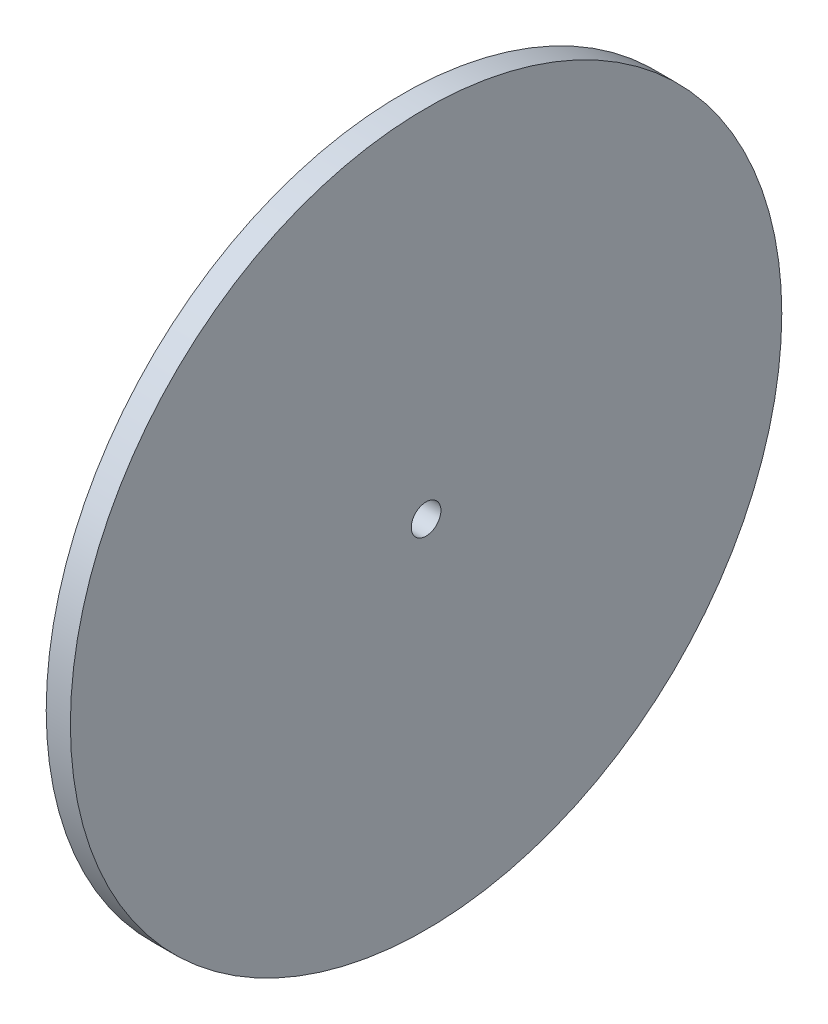
ISO-10303-21;
HEADER;
FILE_DESCRIPTION(('STEP AP214'),'2;1');
FILE_NAME('part.step','',(''),(''),'','','');
FILE_SCHEMA(('AUTOMOTIVE_DESIGN { 1 0 10303 214 1 1 1 1 }'));
ENDSEC;
DATA;
#1=APPLICATION_CONTEXT('core data for automotive mechanical design processes');
#2=APPLICATION_PROTOCOL_DEFINITION('international standard','automotive_design',2000,#1);
#3=PRODUCT_CONTEXT('',#1,'mechanical');
#4=PRODUCT('Part','Part','',(#3));
#5=PRODUCT_RELATED_PRODUCT_CATEGORY('part','',(#4));
#6=PRODUCT_DEFINITION_FORMATION('','',#4);
#7=PRODUCT_DEFINITION_CONTEXT('part definition',#1,'design');
#8=PRODUCT_DEFINITION('design','',#6,#7);
#9=PRODUCT_DEFINITION_SHAPE('','',#8);
#10=(LENGTH_UNIT() NAMED_UNIT(*) SI_UNIT(.MILLI.,.METRE.));
#11=(NAMED_UNIT(*) PLANE_ANGLE_UNIT() SI_UNIT($,.RADIAN.));
#12=(NAMED_UNIT(*) SI_UNIT($,.STERADIAN.) SOLID_ANGLE_UNIT());
#13=UNCERTAINTY_MEASURE_WITH_UNIT(LENGTH_MEASURE(1.E-05),#10,'distance_accuracy_value','');
#14=(GEOMETRIC_REPRESENTATION_CONTEXT(3) GLOBAL_UNCERTAINTY_ASSIGNED_CONTEXT((#13)) GLOBAL_UNIT_ASSIGNED_CONTEXT((#10,
#11,#12)) REPRESENTATION_CONTEXT('',''));
#15=CARTESIAN_POINT('',(0.,0.,0.));
#16=DIRECTION('',(0.,0.,1.));
#17=DIRECTION('',(1.,0.,0.));
#18=AXIS2_PLACEMENT_3D('',#15,#16,#17);
#19=CARTESIAN_POINT('',(0.,0.,0.));
#20=DIRECTION('',(-1.,0.,0.));
#21=DIRECTION('',(0.,0.,1.));
#22=AXIS2_PLACEMENT_3D('',#19,#20,#21);
#23=PLANE('',#22);
#24=CARTESIAN_POINT('',(0.,0.,0.));
#25=DIRECTION('',(1.,0.,0.));
#26=DIRECTION('',(0.,0.,-1.));
#27=AXIS2_PLACEMENT_3D('',#24,#25,#26);
#28=CIRCLE('',#27,1.);
#29=CARTESIAN_POINT('',(0.,0.,-1.));
#30=VERTEX_POINT('',#29);
#31=EDGE_CURVE('E56',#30,#30,#28,.T.);
#32=ORIENTED_EDGE('',*,*,#31,.F.);
#33=EDGE_LOOP('',(#32));
#34=FACE_BOUND('',#33,.T.);
#35=CARTESIAN_POINT('',(0.,0.,0.));
#36=DIRECTION('',(-1.,0.,0.));
#37=DIRECTION('',(0.,0.,1.));
#38=AXIS2_PLACEMENT_3D('',#35,#36,#37);
#39=CIRCLE('',#38,24.);
#40=CARTESIAN_POINT('',(0.,0.,24.));
#41=VERTEX_POINT('',#40);
#42=EDGE_CURVE('E10',#41,#41,#39,.T.);
#43=ORIENTED_EDGE('',*,*,#42,.F.);
#44=EDGE_LOOP('',(#43));
#45=FACE_BOUND('',#44,.T.);
#46=ADVANCED_FACE('F31',(#34,#45),#23,.F.);
#47=CARTESIAN_POINT('',(-1.63,0.,0.));
#48=DIRECTION('',(-1.,0.,0.));
#49=DIRECTION('',(0.,0.,1.));
#50=AXIS2_PLACEMENT_3D('',#47,#48,#49);
#51=CYLINDRICAL_SURFACE('',#50,24.);
#52=CARTESIAN_POINT('',(-1.63,0.,0.));
#53=DIRECTION('',(-1.,0.,0.));
#54=DIRECTION('',(0.,0.,1.));
#55=AXIS2_PLACEMENT_3D('',#52,#53,#54);
#56=CIRCLE('',#55,24.);
#57=CARTESIAN_POINT('',(-1.63,0.,24.));
#58=VERTEX_POINT('',#57);
#59=EDGE_CURVE('E38',#58,#58,#56,.T.);
#60=ORIENTED_EDGE('',*,*,#59,.F.);
#61=EDGE_LOOP('',(#60));
#62=FACE_BOUND('',#61,.T.);
#63=ORIENTED_EDGE('',*,*,#42,.T.);
#64=EDGE_LOOP('',(#63));
#65=FACE_BOUND('',#64,.T.);
#66=ADVANCED_FACE('F75',(#62,#65),#51,.T.);
#67=CARTESIAN_POINT('',(-1.63,24.,0.));
#68=DIRECTION('',(1.,0.,0.));
#69=DIRECTION('',(0.,0.,-1.));
#70=AXIS2_PLACEMENT_3D('',#67,#68,#69);
#71=PLANE('',#70);
#72=CARTESIAN_POINT('',(-1.63,0.,0.));
#73=DIRECTION('',(-1.,0.,0.));
#74=DIRECTION('',(0.,0.,1.));
#75=AXIS2_PLACEMENT_3D('',#72,#73,#74);
#76=CIRCLE('',#75,3.5);
#77=CARTESIAN_POINT('',(-1.63,0.,3.5));
#78=VERTEX_POINT('',#77);
#79=EDGE_CURVE('E42',#78,#78,#76,.T.);
#80=ORIENTED_EDGE('',*,*,#79,.F.);
#81=EDGE_LOOP('',(#80));
#82=FACE_BOUND('',#81,.T.);
#83=ORIENTED_EDGE('',*,*,#59,.T.);
#84=EDGE_LOOP('',(#83));
#85=FACE_BOUND('',#84,.T.);
#86=ADVANCED_FACE('F80',(#82,#85),#71,.F.);
#87=CARTESIAN_POINT('',(-1.63,0.,0.));
#88=DIRECTION('',(-1.,0.,0.));
#89=DIRECTION('',(0.,0.,1.));
#90=AXIS2_PLACEMENT_3D('',#87,#88,#89);
#91=CYLINDRICAL_SURFACE('',#90,3.5);
#92=CARTESIAN_POINT('',(-3.79,0.,0.));
#93=DIRECTION('',(-1.,0.,0.));
#94=DIRECTION('',(0.,0.,1.));
#95=AXIS2_PLACEMENT_3D('',#92,#93,#94);
#96=CIRCLE('',#95,3.5);
#97=CARTESIAN_POINT('',(-3.79,0.,3.5));
#98=VERTEX_POINT('',#97);
#99=EDGE_CURVE('E47',#98,#98,#96,.T.);
#100=ORIENTED_EDGE('',*,*,#99,.F.);
#101=EDGE_LOOP('',(#100));
#102=FACE_BOUND('',#101,.T.);
#103=ORIENTED_EDGE('',*,*,#79,.T.);
#104=EDGE_LOOP('',(#103));
#105=FACE_BOUND('',#104,.T.);
#106=ADVANCED_FACE('F86',(#102,#105),#91,.T.);
#107=CARTESIAN_POINT('',(-3.79,3.5,0.));
#108=DIRECTION('',(1.,0.,0.));
#109=DIRECTION('',(0.,0.,-1.));
#110=AXIS2_PLACEMENT_3D('',#107,#108,#109);
#111=PLANE('',#110);
#112=CARTESIAN_POINT('',(-3.79,0.,0.));
#113=DIRECTION('',(-1.,0.,0.));
#114=DIRECTION('',(0.,0.,1.));
#115=AXIS2_PLACEMENT_3D('',#112,#113,#114);
#116=CIRCLE('',#115,2.35);
#117=CARTESIAN_POINT('',(-3.79,0.,2.35));
#118=VERTEX_POINT('',#117);
#119=EDGE_CURVE('E50',#118,#118,#116,.T.);
#120=ORIENTED_EDGE('',*,*,#119,.F.);
#121=EDGE_LOOP('',(#120));
#122=FACE_BOUND('',#121,.T.);
#123=ORIENTED_EDGE('',*,*,#99,.T.);
#124=EDGE_LOOP('',(#123));
#125=FACE_BOUND('',#124,.T.);
#126=ADVANCED_FACE('F93',(#122,#125),#111,.F.);
#127=CARTESIAN_POINT('',(-1.63,0.,0.));
#128=DIRECTION('',(-1.,0.,0.));
#129=DIRECTION('',(0.,0.,1.));
#130=AXIS2_PLACEMENT_3D('',#127,#128,#129);
#131=CYLINDRICAL_SURFACE('',#130,2.35);
#132=CARTESIAN_POINT('',(-1.63,0.,0.));
#133=DIRECTION('',(-1.,0.,0.));
#134=DIRECTION('',(0.,0.,1.));
#135=AXIS2_PLACEMENT_3D('',#132,#133,#134);
#136=CIRCLE('',#135,2.35);
#137=CARTESIAN_POINT('',(-1.63,0.,2.35));
#138=VERTEX_POINT('',#137);
#139=EDGE_CURVE('E53',#138,#138,#136,.T.);
#140=ORIENTED_EDGE('',*,*,#139,.F.);
#141=EDGE_LOOP('',(#140));
#142=FACE_BOUND('',#141,.T.);
#143=ORIENTED_EDGE('',*,*,#119,.T.);
#144=EDGE_LOOP('',(#143));
#145=FACE_BOUND('',#144,.T.);
#146=ADVANCED_FACE('F72',(#142,#145),#131,.F.);
#147=CARTESIAN_POINT('',(-1.63,2.35,0.));
#148=DIRECTION('',(1.,0.,0.));
#149=DIRECTION('',(0.,0.,-1.));
#150=AXIS2_PLACEMENT_3D('',#147,#148,#149);
#151=PLANE('',#150);
#152=CARTESIAN_POINT('',(-1.63,0.,0.));
#153=DIRECTION('',(1.,0.,0.));
#154=DIRECTION('',(0.,0.,-1.));
#155=AXIS2_PLACEMENT_3D('',#152,#153,#154);
#156=CIRCLE('',#155,1.);
#157=CARTESIAN_POINT('',(-1.63,0.,-1.));
#158=VERTEX_POINT('',#157);
#159=EDGE_CURVE('E34',#158,#158,#156,.T.);
#160=ORIENTED_EDGE('',*,*,#159,.T.);
#161=EDGE_LOOP('',(#160));
#162=FACE_BOUND('',#161,.T.);
#163=ORIENTED_EDGE('',*,*,#139,.T.);
#164=EDGE_LOOP('',(#163));
#165=FACE_BOUND('',#164,.T.);
#166=ADVANCED_FACE('F63',(#162,#165),#151,.F.);
#167=CARTESIAN_POINT('',(-3.79,0.,0.));
#168=DIRECTION('',(1.,0.,0.));
#169=DIRECTION('',(0.,0.,-1.));
#170=AXIS2_PLACEMENT_3D('',#167,#168,#169);
#171=CYLINDRICAL_SURFACE('',#170,1.);
#172=ORIENTED_EDGE('',*,*,#31,.T.);
#173=EDGE_LOOP('',(#172));
#174=FACE_BOUND('',#173,.T.);
#175=ORIENTED_EDGE('',*,*,#159,.F.);
#176=EDGE_LOOP('',(#175));
#177=FACE_BOUND('',#176,.T.);
#178=ADVANCED_FACE('F66',(#174,#177),#171,.F.);
#179=CLOSED_SHELL('',(#46,#66,#86,#106,#126,#146,#166,#178));
#180=MANIFOLD_SOLID_BREP('B2',#179);
#181=ADVANCED_BREP_SHAPE_REPRESENTATION('',(#18,#180),#14);
#182=SHAPE_DEFINITION_REPRESENTATION(#9,#181);
ENDSEC;
END-ISO-10303-21;
